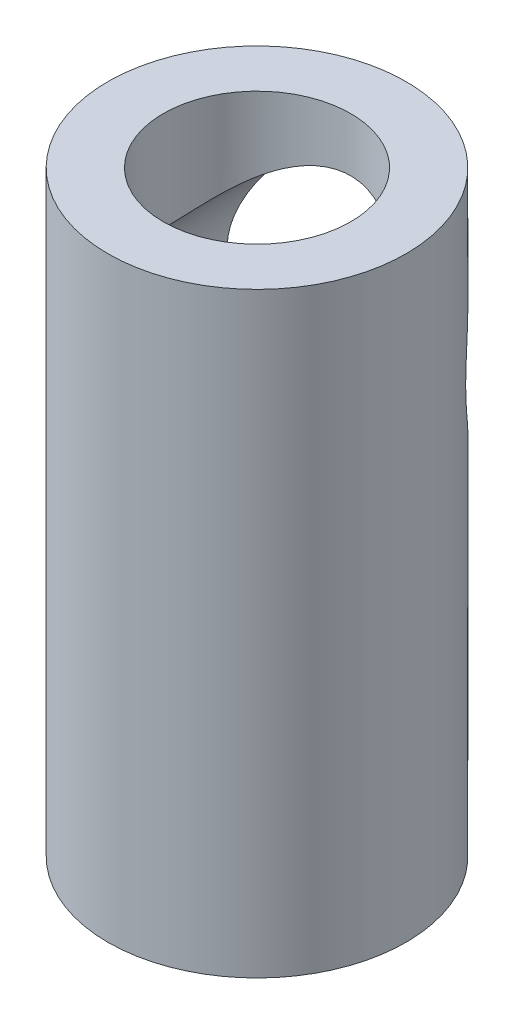
ISO-10303-21;
HEADER;
FILE_DESCRIPTION(('STEP AP214'),'2;1');
FILE_NAME('part.step','',(''),(''),'','','');
FILE_SCHEMA(('AUTOMOTIVE_DESIGN { 1 0 10303 214 1 1 1 1 }'));
ENDSEC;
DATA;
#1=APPLICATION_CONTEXT('core data for automotive mechanical design processes');
#2=APPLICATION_PROTOCOL_DEFINITION('international standard','automotive_design',2000,#1);
#3=PRODUCT_CONTEXT('',#1,'mechanical');
#4=PRODUCT('Part','Part','',(#3));
#5=PRODUCT_RELATED_PRODUCT_CATEGORY('part','',(#4));
#6=PRODUCT_DEFINITION_FORMATION('','',#4);
#7=PRODUCT_DEFINITION_CONTEXT('part definition',#1,'design');
#8=PRODUCT_DEFINITION('design','',#6,#7);
#9=PRODUCT_DEFINITION_SHAPE('','',#8);
#10=(LENGTH_UNIT() NAMED_UNIT(*) SI_UNIT(.MILLI.,.METRE.));
#11=(NAMED_UNIT(*) PLANE_ANGLE_UNIT() SI_UNIT($,.RADIAN.));
#12=(NAMED_UNIT(*) SI_UNIT($,.STERADIAN.) SOLID_ANGLE_UNIT());
#13=UNCERTAINTY_MEASURE_WITH_UNIT(LENGTH_MEASURE(1.E-05),#10,'distance_accuracy_value','');
#14=(GEOMETRIC_REPRESENTATION_CONTEXT(3) GLOBAL_UNCERTAINTY_ASSIGNED_CONTEXT((#13)) GLOBAL_UNIT_ASSIGNED_CONTEXT((#10,
#11,#12)) REPRESENTATION_CONTEXT('',''));
#15=CARTESIAN_POINT('',(0.,0.,0.));
#16=DIRECTION('',(0.,0.,1.));
#17=DIRECTION('',(1.,0.,0.));
#18=AXIS2_PLACEMENT_3D('',#15,#16,#17);
#19=CARTESIAN_POINT('',(0.,12.7,0.));
#20=DIRECTION('',(0.,-1.,0.));
#21=DIRECTION('',(0.,0.,-1.));
#22=AXIS2_PLACEMENT_3D('',#19,#20,#21);
#23=CYLINDRICAL_SURFACE('',#22,1.99644);
#24=CARTESIAN_POINT('',(0.,12.7,0.));
#25=DIRECTION('',(0.,1.,0.));
#26=DIRECTION('',(0.,0.,1.));
#27=AXIS2_PLACEMENT_3D('',#24,#25,#26);
#28=CIRCLE('',#27,1.99644);
#29=CARTESIAN_POINT('',(0.,12.7,1.99644));
#30=VERTEX_POINT('',#29);
#31=EDGE_CURVE('E95',#30,#30,#28,.T.);
#32=ORIENTED_EDGE('',*,*,#31,.T.);
#33=EDGE_LOOP('',(#32));
#34=FACE_BOUND('',#33,.T.);
#35=CARTESIAN_POINT('',(0.,0.,0.));
#36=DIRECTION('',(0.,1.,0.));
#37=DIRECTION('',(0.,0.,1.));
#38=AXIS2_PLACEMENT_3D('',#35,#36,#37);
#39=CIRCLE('',#38,1.99644);
#40=CARTESIAN_POINT('',(0.,0.,1.99644));
#41=VERTEX_POINT('',#40);
#42=EDGE_CURVE('E94',#41,#41,#39,.T.);
#43=ORIENTED_EDGE('',*,*,#42,.F.);
#44=EDGE_LOOP('',(#43));
#45=FACE_BOUND('',#44,.T.);
#46=CARTESIAN_POINT('',(1.99644,10.5822152991078,0.));
#47=CARTESIAN_POINT('',(1.9964463005246,10.5821966242857,-0.0387337429799469));
#48=CARTESIAN_POINT('',(1.99531228646733,10.5836497636297,-0.0774435311662304));
#49=CARTESIAN_POINT('',(1.99082713137895,10.5893317887897,-0.154468643708445));
#50=CARTESIAN_POINT('',(1.98747956822351,10.5935561951743,-0.192784503462716));
#51=CARTESIAN_POINT('',(1.97432408202278,10.6099950128558,-0.305795305995765));
#52=CARTESIAN_POINT('',(1.9613994796463,10.6259842645535,-0.379601433342756));
#53=CARTESIAN_POINT('',(1.92237889862255,10.6724136869936,-0.547763572937045));
#54=CARTESIAN_POINT('',(1.89329294440609,10.705923531777,-0.640535106962406));
#55=CARTESIAN_POINT('',(1.8234033956879,10.7809452721918,-0.818663209838582));
#56=CARTESIAN_POINT('',(1.78251817704875,10.8225122233225,-0.903962536833252));
#57=CARTESIAN_POINT('',(1.67489823815165,10.9233031721375,-1.09361707783881));
#58=CARTESIAN_POINT('',(1.60408561400169,10.9838270844775,-1.19497061049904));
#59=CARTESIAN_POINT('',(1.44475788948671,11.103380142199,-1.38333195877657));
#60=CARTESIAN_POINT('',(1.35627468377699,11.1624117678887,-1.47036511316438));
#61=CARTESIAN_POINT('',(1.18055956090027,11.2627147744716,-1.61316213452902));
#62=CARTESIAN_POINT('',(1.09631660209154,11.305224829584,-1.67172337897861));
#63=CARTESIAN_POINT('',(0.917178107880033,11.3825447532901,-1.77630936949658));
#64=CARTESIAN_POINT('',(0.822297255265876,11.4173650430194,-1.82235110177876));
#65=CARTESIAN_POINT('',(0.639178688856935,11.4717346256601,-1.89348787829357));
#66=CARTESIAN_POINT('',(0.552240526766419,11.4928238915142,-1.9207377349837));
#67=CARTESIAN_POINT('',(0.373802531060684,11.5258979164794,-1.96327243081508));
#68=CARTESIAN_POINT('',(0.282305275491662,11.5378877601841,-1.97856395220515));
#69=CARTESIAN_POINT('',(0.0969965506050353,11.5517720340635,-1.99625942570149));
#70=CARTESIAN_POINT('',(0.00317863503521173,11.5536341672712,-1.99862214840026));
#71=CARTESIAN_POINT('',(-0.18349081737818,11.5470047766862,-1.99018446656658));
#72=CARTESIAN_POINT('',(-0.276342280998579,11.5385124740668,-1.97938307187243));
#73=CARTESIAN_POINT('',(-0.453734743042755,11.5125938717335,-1.94618670678741));
#74=CARTESIAN_POINT('',(-0.538459517495308,11.4956315210298,-1.9243932606563));
#75=CARTESIAN_POINT('',(-0.702688416558516,11.4542567745515,-1.87068809611802));
#76=CARTESIAN_POINT('',(-0.782191064608584,11.429842282603,-1.83877353069553));
#77=CARTESIAN_POINT('',(-0.942425555503632,11.3722990483318,-1.76245688666435));
#78=CARTESIAN_POINT('',(-1.02248497358637,11.3385429429304,-1.71712507020438));
#79=CARTESIAN_POINT('',(-1.17404224390333,11.2658721514335,-1.61729525224422));
#80=CARTESIAN_POINT('',(-1.2455362747498,11.226955179046,-1.56279318538053));
#81=CARTESIAN_POINT('',(-1.39331052911668,11.1377533463852,-1.43385673586733));
#82=CARTESIAN_POINT('',(-1.46759650984634,11.086768142925,-1.35762387924088));
#83=CARTESIAN_POINT('',(-1.60314101957608,10.983918902561,-1.19456377019594));
#84=CARTESIAN_POINT('',(-1.66437327425071,10.9320533158698,-1.10771569393994));
#85=CARTESIAN_POINT('',(-1.76601593740187,10.8386416493312,-0.935739766214314));
#86=CARTESIAN_POINT('',(-1.8080975861482,10.7966300639973,-0.851852729875215));
#87=CARTESIAN_POINT('',(-1.88070292177933,10.7199382300122,-0.676493531540345));
#88=CARTESIAN_POINT('',(-1.91129634546775,10.6852143301899,-0.585071383702938));
#89=CARTESIAN_POINT('',(-1.94514990375713,10.6453903907417,-0.451399784491367));
#90=CARTESIAN_POINT('',(-1.95386860644447,10.6349235953403,-0.412085885343346));
#91=CARTESIAN_POINT('',(-1.96898491117781,10.6165502582146,-0.332434749252515));
#92=CARTESIAN_POINT('',(-1.97538381573136,10.6086422800484,-0.29209810021338));
#93=CARTESIAN_POINT('',(-1.98579238178351,10.5956824755678,-0.210071230083495));
#94=CARTESIAN_POINT('',(-1.98976757750303,10.5906719003926,-0.168369986071626));
#95=CARTESIAN_POINT('',(-1.99510016605165,10.5839186463664,-0.0844537132395872));
#96=CARTESIAN_POINT('',(-1.99645210729457,10.5821827731316,-0.0422377975387303));
#97=CARTESIAN_POINT('',(-1.99644,10.5822152991078,0.));
#98=B_SPLINE_CURVE_WITH_KNOTS('',3,(#46,#47,#48,#49,#50,#51,#52,#53,#54,#55,#56,#57,#58,#59,#60,
#61,#62,#63,#64,#65,#66,#67,#68,#69,#70,#71,#72,#73,#74,#75,#76,#77,#78,#79,#80,#81,#82,#83,#84,
#85,#86,#87,#88,#89,#90,#91,#92,#93,#94,#95,#96,#97),.UNSPECIFIED.,.F.,.F.,(4,2,2,2,2,2,2,2,2,2,
2,2,2,2,2,2,2,2,2,2,2,2,2,2,2,4),(0.,0.116114994838728,0.232042764191195,0.460801420564548,
0.767641512295879,1.07665732184653,1.48765687258356,1.89792118430971,2.22982502960757,
2.56127628187379,2.84063522513028,3.11983795245384,3.39993052915913,3.68004417480938,
3.9462661797961,4.21256313809551,4.50549555917943,4.79855818714912,5.15134943727248,
5.5048442120093,5.81244042285375,6.11813803552827,6.24283359782176,6.36745903790041,
6.49381769242233,6.62043866248348),.UNSPECIFIED.);
#99=CARTESIAN_POINT('',(1.99644,10.5822152991078,0.));
#100=VERTEX_POINT('',#99);
#101=CARTESIAN_POINT('',(-1.99644,10.5822152991078,0.));
#102=VERTEX_POINT('',#101);
#103=EDGE_CURVE('E41',#100,#102,#98,.T.);
#104=ORIENTED_EDGE('',*,*,#103,.F.);
#105=DIRECTION('',(0.,-1.,0.));
#106=VECTOR('',#105,1.);
#107=CARTESIAN_POINT('',(1.99644,12.7,0.));
#108=LINE('',#107,#106);
#109=CARTESIAN_POINT('',(1.99644,7.44162470089222,0.));
#110=VERTEX_POINT('',#109);
#111=EDGE_CURVE('E11',#100,#110,#108,.T.);
#112=ORIENTED_EDGE('',*,*,#111,.T.);
#113=CARTESIAN_POINT('',(-1.99644,7.44162470089222,0.));
#114=CARTESIAN_POINT('',(-1.9964463005246,7.4416433757143,-0.0387337429799468));
#115=CARTESIAN_POINT('',(-1.99531228646733,7.44019023637029,-0.0774435311662303));
#116=CARTESIAN_POINT('',(-1.99082713137895,7.43450821121027,-0.154468643708444));
#117=CARTESIAN_POINT('',(-1.98747956822351,7.43028380482575,-0.192784503462716));
#118=CARTESIAN_POINT('',(-1.97432408202278,7.4138449871442,-0.305795305995765));
#119=CARTESIAN_POINT('',(-1.9613994796463,7.39785573544649,-0.379601433342756));
#120=CARTESIAN_POINT('',(-1.92237889862255,7.35142631300639,-0.547763572937044));
#121=CARTESIAN_POINT('',(-1.89329294440609,7.31791646822298,-0.640535106962405));
#122=CARTESIAN_POINT('',(-1.8234033956879,7.24289472780824,-0.818663209838581));
#123=CARTESIAN_POINT('',(-1.78251817704875,7.20132777667751,-0.90396253683325));
#124=CARTESIAN_POINT('',(-1.67489823815165,7.1005368278625,-1.0936170778388));
#125=CARTESIAN_POINT('',(-1.60408561400169,7.0400129155225,-1.19497061049904));
#126=CARTESIAN_POINT('',(-1.44475788948671,6.92045985780098,-1.38333195877657));
#127=CARTESIAN_POINT('',(-1.35627468377699,6.8614282321113,-1.47036511316438));
#128=CARTESIAN_POINT('',(-1.18055956090027,6.76112522552838,-1.61316213452902));
#129=CARTESIAN_POINT('',(-1.09631660209154,6.71861517041604,-1.67172337897861));
#130=CARTESIAN_POINT('',(-0.917178107880034,6.64129524670986,-1.77630936949658));
#131=CARTESIAN_POINT('',(-0.822297255265876,6.60647495698061,-1.82235110177876));
#132=CARTESIAN_POINT('',(-0.639178688856935,6.55210537433995,-1.89348787829357));
#133=CARTESIAN_POINT('',(-0.552240526766419,6.53101610848578,-1.9207377349837));
#134=CARTESIAN_POINT('',(-0.373802531060684,6.49794208352065,-1.96327243081508));
#135=CARTESIAN_POINT('',(-0.282305275491662,6.48595223981587,-1.97856395220515));
#136=CARTESIAN_POINT('',(-0.0969965506050353,6.4720679659365,-1.99625942570149));
#137=CARTESIAN_POINT('',(-0.0031786350352115,6.47020583272882,-1.99862214840026));
#138=CARTESIAN_POINT('',(0.18349081737818,6.47683522331381,-1.99018446656658));
#139=CARTESIAN_POINT('',(0.276342280998579,6.48532752593319,-1.97938307187243));
#140=CARTESIAN_POINT('',(0.453734743042756,6.51124612826647,-1.94618670678741));
#141=CARTESIAN_POINT('',(0.538459517495308,6.52820847897017,-1.9243932606563));
#142=CARTESIAN_POINT('',(0.702688416558516,6.56958322544851,-1.87068809611802));
#143=CARTESIAN_POINT('',(0.782191064608584,6.59399771739699,-1.83877353069553));
#144=CARTESIAN_POINT('',(0.942425555503632,6.65154095166822,-1.76245688666435));
#145=CARTESIAN_POINT('',(1.02248497358637,6.6852970570696,-1.71712507020438));
#146=CARTESIAN_POINT('',(1.17404224390333,6.75796784856649,-1.61729525224422));
#147=CARTESIAN_POINT('',(1.2455362747498,6.79688482095399,-1.56279318538053));
#148=CARTESIAN_POINT('',(1.39331052911668,6.88608665361482,-1.43385673586733));
#149=CARTESIAN_POINT('',(1.46759650984634,6.93707185707505,-1.35762387924088));
#150=CARTESIAN_POINT('',(1.60314101957608,7.03992109743897,-1.19456377019594));
#151=CARTESIAN_POINT('',(1.66437327425071,7.09178668413025,-1.10771569393994));
#152=CARTESIAN_POINT('',(1.76601593740187,7.18519835066877,-0.935739766214314));
#153=CARTESIAN_POINT('',(1.8080975861482,7.22720993600265,-0.851852729875216));
#154=CARTESIAN_POINT('',(1.88070292177933,7.30390176998783,-0.676493531540346));
#155=CARTESIAN_POINT('',(1.91129634546775,7.33862566981008,-0.585071383702938));
#156=CARTESIAN_POINT('',(1.94514990375713,7.37844960925827,-0.451399784491367));
#157=CARTESIAN_POINT('',(1.95386860644447,7.38891640465967,-0.412085885343346));
#158=CARTESIAN_POINT('',(1.96898491117781,7.40728974178542,-0.332434749252515));
#159=CARTESIAN_POINT('',(1.97538381573136,7.41519771995159,-0.29209810021338));
#160=CARTESIAN_POINT('',(1.98579238178351,7.42815752443225,-0.210071230083495));
#161=CARTESIAN_POINT('',(1.98976757750303,7.43316809960737,-0.168369986071626));
#162=CARTESIAN_POINT('',(1.99510016605165,7.43992135363365,-0.0844537132395879));
#163=CARTESIAN_POINT('',(1.99645210729457,7.44165722686845,-0.0422377975387307));
#164=CARTESIAN_POINT('',(1.99644,7.44162470089219,0.));
#165=B_SPLINE_CURVE_WITH_KNOTS('',3,(#113,#114,#115,#116,#117,#118,#119,#120,#121,#122,#123,
#124,#125,#126,#127,#128,#129,#130,#131,#132,#133,#134,#135,#136,#137,#138,#139,#140,#141,#142,
#143,#144,#145,#146,#147,#148,#149,#150,#151,#152,#153,#154,#155,#156,#157,#158,#159,#160,#161,
#162,#163,#164),.UNSPECIFIED.,.F.,.F.,(4,2,2,2,2,2,2,2,2,2,2,2,2,2,2,2,2,2,2,2,2,2,2,2,2,4),(0.,
0.116114994838728,0.232042764191194,0.460801420564547,0.767641512295877,1.07665732184653,
1.48765687258356,1.89792118430971,2.22982502960757,2.56127628187379,2.84063522513028,
3.11983795245384,3.39993052915913,3.68004417480938,3.9462661797961,4.21256313809551,
4.50549555917943,4.79855818714912,5.15134943727248,5.5048442120093,5.81244042285375,
6.11813803552827,6.24283359782176,6.36745903790041,6.49381769242233,6.62043866248347),.UNSPECIFIED.);
#166=CARTESIAN_POINT('',(-1.99644,7.44162470089222,0.));
#167=VERTEX_POINT('',#166);
#168=EDGE_CURVE('E68',#167,#110,#165,.T.);
#169=ORIENTED_EDGE('',*,*,#168,.F.);
#170=DIRECTION('',(0.,-1.,0.));
#171=VECTOR('',#170,1.);
#172=CARTESIAN_POINT('',(-1.99644,12.7,0.));
#173=LINE('',#172,#171);
#174=EDGE_CURVE('E51',#167,#102,#173,.F.);
#175=ORIENTED_EDGE('',*,*,#174,.T.);
#176=EDGE_LOOP('',(#104,#112,#169,#175));
#177=FACE_BOUND('',#176,.T.);
#178=ADVANCED_FACE('F32',(#34,#45,#177),#23,.F.);
#179=CARTESIAN_POINT('',(0.,12.7,0.));
#180=DIRECTION('',(0.,1.,0.));
#181=DIRECTION('',(0.,0.,1.));
#182=AXIS2_PLACEMENT_3D('',#179,#180,#181);
#183=PLANE('',#182);
#184=CARTESIAN_POINT('',(0.,12.7,0.));
#185=DIRECTION('',(0.,1.,0.));
#186=DIRECTION('',(0.,0.,1.));
#187=AXIS2_PLACEMENT_3D('',#184,#185,#186);
#188=CIRCLE('',#187,3.175);
#189=CARTESIAN_POINT('',(0.,12.7,3.175));
#190=VERTEX_POINT('',#189);
#191=EDGE_CURVE('E101',#190,#190,#188,.T.);
#192=ORIENTED_EDGE('',*,*,#191,.T.);
#193=EDGE_LOOP('',(#192));
#194=FACE_BOUND('',#193,.T.);
#195=ORIENTED_EDGE('',*,*,#31,.F.);
#196=EDGE_LOOP('',(#195));
#197=FACE_BOUND('',#196,.T.);
#198=ADVANCED_FACE('F111',(#194,#197),#183,.T.);
#199=CARTESIAN_POINT('',(0.,0.,0.));
#200=DIRECTION('',(0.,1.,0.));
#201=DIRECTION('',(0.,0.,1.));
#202=AXIS2_PLACEMENT_3D('',#199,#200,#201);
#203=PLANE('',#202);
#204=CARTESIAN_POINT('',(0.,0.,0.));
#205=DIRECTION('',(0.,1.,0.));
#206=DIRECTION('',(0.,0.,1.));
#207=AXIS2_PLACEMENT_3D('',#204,#205,#206);
#208=CIRCLE('',#207,3.175);
#209=CARTESIAN_POINT('',(0.,0.,3.175));
#210=VERTEX_POINT('',#209);
#211=EDGE_CURVE('E98',#210,#210,#208,.T.);
#212=ORIENTED_EDGE('',*,*,#211,.F.);
#213=EDGE_LOOP('',(#212));
#214=FACE_BOUND('',#213,.T.);
#215=ORIENTED_EDGE('',*,*,#42,.T.);
#216=EDGE_LOOP('',(#215));
#217=FACE_BOUND('',#216,.T.);
#218=ADVANCED_FACE('F108',(#214,#217),#203,.F.);
#219=CARTESIAN_POINT('',(0.,12.7,0.));
#220=DIRECTION('',(0.,-1.,0.));
#221=DIRECTION('',(0.,0.,-1.));
#222=AXIS2_PLACEMENT_3D('',#219,#220,#221);
#223=CYLINDRICAL_SURFACE('',#222,3.175);
#224=CARTESIAN_POINT('',(0.,11.55192,-3.175));
#225=CARTESIAN_POINT('',(-0.121916056806821,11.551910381511,-3.17499067440978));
#226=CARTESIAN_POINT('',(-0.244009117648219,11.5430688541664,-3.16790542167364));
#227=CARTESIAN_POINT('',(-0.484275631656092,11.5082955475146,-3.14019267794238));
#228=CARTESIAN_POINT('',(-0.602439805075391,11.4823259612644,-3.11953522928575));
#229=CARTESIAN_POINT('',(-0.830700396816502,11.4151686923597,-3.06662752834783));
#230=CARTESIAN_POINT('',(-0.940843005309833,11.3740780402914,-3.03445122657939));
#231=CARTESIAN_POINT('',(-1.15179698240407,11.2787205771733,-2.96082673890646));
#232=CARTESIAN_POINT('',(-1.25260832144289,11.2244537243824,-2.91937852362935));
#233=CARTESIAN_POINT('',(-1.47723739630781,11.0837639715427,-2.814013964251));
#234=CARTESIAN_POINT('',(-1.59684492679289,10.9927236266683,-2.74729930858401));
#235=CARTESIAN_POINT('',(-1.81663743277592,10.7933681822833,-2.60719770642894));
#236=CARTESIAN_POINT('',(-1.9167645970712,10.6850033522324,-2.53379182148377));
#237=CARTESIAN_POINT('',(-2.05251440851993,10.5100307722808,-2.4230781427805));
#238=CARTESIAN_POINT('',(-2.09564259655402,10.449097364641,-2.38577210507023));
#239=CARTESIAN_POINT('',(-2.17663118203204,10.3232107112069,-2.31211856629064));
#240=CARTESIAN_POINT('',(-2.21448991412076,10.258256203915,-2.27577137118137));
#241=CARTESIAN_POINT('',(-2.28461962929066,10.1244846762943,-2.20535720711848));
#242=CARTESIAN_POINT('',(-2.31690574413233,10.0556788097027,-2.17128422240549));
#243=CARTESIAN_POINT('',(-2.37564828002066,9.9140123499401,-2.10685050405413));
#244=CARTESIAN_POINT('',(-2.4021096817228,9.84115528821686,-2.07648660877656));
#245=CARTESIAN_POINT('',(-2.45218859937187,9.68012375949292,-2.01720580480069));
#246=CARTESIAN_POINT('',(-2.47479043828276,9.59128717153127,-1.98918297776046));
#247=CARTESIAN_POINT('',(-2.51045324124669,9.40915183237907,-1.94398945258816));
#248=CARTESIAN_POINT('',(-2.52353766108226,9.31586465912017,-1.9267920891738));
#249=CARTESIAN_POINT('',(-2.53923570130587,9.12597783672581,-1.90606928123794));
#250=CARTESIAN_POINT('',(-2.5417570317968,9.02935639784543,-1.90266434993769));
#251=CARTESIAN_POINT('',(-2.53580237504371,8.83703360254909,-1.91058760234381));
#252=CARTESIAN_POINT('',(-2.52731708059048,8.74133309384127,-1.92192825494492));
#253=CARTESIAN_POINT('',(-2.4980308524335,8.53920045232671,-1.95987335440708));
#254=CARTESIAN_POINT('',(-2.47550909839874,8.43343522399161,-1.98859033885116));
#255=CARTESIAN_POINT('',(-2.41864361078571,8.22890941675305,-2.05736679355416));
#256=CARTESIAN_POINT('',(-2.38426486174821,8.13017064177255,-2.0974597959851));
#257=CARTESIAN_POINT('',(-2.31516532928433,7.96430565259803,-2.17314568245185));
#258=CARTESIAN_POINT('',(-2.28274974571616,7.8955204368362,-2.20729465009924));
#259=CARTESIAN_POINT('',(-2.21244149211587,7.76196038996822,-2.27776451851087));
#260=CARTESIAN_POINT('',(-2.17454629070866,7.6971874322353,-2.31408641851564));
#261=CARTESIAN_POINT('',(-2.05287712397247,7.50868820434028,-2.42451522131284));
#262=CARTESIAN_POINT('',(-1.96113794094088,7.39082486467285,-2.50006385092802));
#263=CARTESIAN_POINT('',(-1.75443281259859,7.16877645245503,-2.64940692741269));
#264=CARTESIAN_POINT('',(-1.63891345424478,7.06503915247778,-2.72310110288538));
#265=CARTESIAN_POINT('',(-1.38682587170398,6.87820012423629,-2.85967617666903));
#266=CARTESIAN_POINT('',(-1.25031568575768,6.79504309890518,-2.92258590857053));
#267=CARTESIAN_POINT('',(-1.00047701457708,6.67440414037754,-3.01529329761312));
#268=CARTESIAN_POINT('',(-0.891765496795295,6.63066399983512,-3.04941088850288));
#269=CARTESIAN_POINT('',(-0.666640899895133,6.5581196865614,-3.10638878047358));
#270=CARTESIAN_POINT('',(-0.550233700270669,6.52930425672557,-3.1292575654161));
#271=CARTESIAN_POINT('',(-0.3120557484768,6.48825396999684,-3.16192333979135));
#272=CARTESIAN_POINT('',(-0.190260344528543,6.47610574143051,-3.17165202911017));
#273=CARTESIAN_POINT('',(0.0541121480131782,6.46955902793976,-3.17688824985488));
#274=CARTESIAN_POINT('',(0.17668908675252,6.47515723668043,-3.17239843032823));
#275=CARTESIAN_POINT('',(0.408618279875381,6.50250517187019,-3.15057610960551));
#276=CARTESIAN_POINT('',(0.518237333524822,6.52290945114934,-3.13431367684265));
#277=CARTESIAN_POINT('',(0.731946305276196,6.57716767127657,-3.09140241651237));
#278=CARTESIAN_POINT('',(0.836034572070747,6.61102560363662,-3.06475050657596));
#279=CARTESIAN_POINT('',(1.04296956478185,6.69309097180041,-3.00088108815239));
#280=CARTESIAN_POINT('',(1.14534139675652,6.74205634809921,-2.96311209183829));
#281=CARTESIAN_POINT('',(1.34037070559947,6.85147493263902,-2.88015200849108));
#282=CARTESIAN_POINT('',(1.43302769765854,6.91192871377418,-2.83496055133617));
#283=CARTESIAN_POINT('',(1.6246505172263,7.05513488436034,-2.73041983146999));
#284=CARTESIAN_POINT('',(1.72149413131872,7.13994214754575,-2.67000951566095));
#285=CARTESIAN_POINT('',(1.90060183219128,7.32204144030697,-2.54563242438724));
#286=CARTESIAN_POINT('',(1.9828227760452,7.41936900036895,-2.48165583311078));
#287=CARTESIAN_POINT('',(2.10271979738413,7.58499174437738,-2.37965151760253));
#288=CARTESIAN_POINT('',(2.14520452278852,7.64966795473787,-2.34130524197817));
#289=CARTESIAN_POINT('',(2.22446852236799,7.78335026752446,-2.26612977994706));
#290=CARTESIAN_POINT('',(2.26124476990605,7.8523586398183,-2.22930140588074));
#291=CARTESIAN_POINT('',(2.32865642406995,7.99450935477488,-2.15878554170672));
#292=CARTESIAN_POINT('',(2.35931301699906,8.06763627022831,-2.12508743916287));
#293=CARTESIAN_POINT('',(2.41413621132369,8.21822142873801,-2.06259479208208));
#294=CARTESIAN_POINT('',(2.43831081807813,8.29567418505562,-2.0337942152599));
#295=CARTESIAN_POINT('',(2.48107410278354,8.46085012330635,-1.98144663954073));
#296=CARTESIAN_POINT('',(2.49910040803062,8.54890677818625,-1.95846340273127));
#297=CARTESIAN_POINT('',(2.52576210184161,8.72850377444938,-1.92396581878866));
#298=CARTESIAN_POINT('',(2.53442118096212,8.82003471863629,-1.91242254519817));
#299=CARTESIAN_POINT('',(2.54167714779861,9.00474284722886,-1.90277415620508));
#300=CARTESIAN_POINT('',(2.54021997010044,9.09792621817986,-1.90474124510769));
#301=CARTESIAN_POINT('',(2.52725578930016,9.28240995378061,-1.92190080460199));
#302=CARTESIAN_POINT('',(2.51573285283507,9.37370709802192,-1.93711424307603));
#303=CARTESIAN_POINT('',(2.4791384138358,9.57657046844474,-1.98382985522335));
#304=CARTESIAN_POINT('',(2.4512174062928,9.68682674733172,-2.01865549946641));
#305=CARTESIAN_POINT('',(2.38262367002429,9.89918508705041,-2.09916920976265));
#306=CARTESIAN_POINT('',(2.34191337500132,10.0012619993055,-2.14488917919507));
#307=CARTESIAN_POINT('',(2.26180450174411,10.1703826093669,-2.22873672661885));
#308=CARTESIAN_POINT('',(2.22507321384965,10.239391292699,-2.26553679421145));
#309=CARTESIAN_POINT('',(2.14585234171697,10.3731568393509,-2.34071002847767));
#310=CARTESIAN_POINT('',(2.10336041534563,10.4379119572961,-2.37908383054344));
#311=CARTESIAN_POINT('',(2.01274435888431,10.5631887775406,-2.45622189782701));
#312=CARTESIAN_POINT('',(1.96461678278865,10.623707853133,-2.4949863885594));
#313=CARTESIAN_POINT('',(1.86283257687258,10.7403464229814,-2.57187964652039));
#314=CARTESIAN_POINT('',(1.80917310856298,10.7964636323147,-2.61000807560259));
#315=CARTESIAN_POINT('',(1.63841517285142,10.9592502311975,-2.7230364455779));
#316=CARTESIAN_POINT('',(1.51261205501336,11.0588545691878,-2.79561799333142));
#317=CARTESIAN_POINT('',(1.308071147282,11.1907092454186,-2.89401498363328));
#318=CARTESIAN_POINT('',(1.23730205085332,11.2317147629242,-2.92505149614458));
#319=CARTESIAN_POINT('',(1.0907479383402,11.3072756504782,-2.98279779640671));
#320=CARTESIAN_POINT('',(1.0149660308878,11.3418349681893,-3.00951023089613));
#321=CARTESIAN_POINT('',(0.831896987075438,11.414481426834,-3.06604626395477));
#322=CARTESIAN_POINT('',(0.722769759834727,11.4496631882266,-3.09375693819079));
#323=CARTESIAN_POINT('',(0.498745877533643,11.505130050677,-3.13764738721121));
#324=CARTESIAN_POINT('',(0.383865187493357,11.5254541714818,-3.15385736227613));
#325=CARTESIAN_POINT('',(0.223368768181192,11.54247505402,-3.16744831636526));
#326=CARTESIAN_POINT('',(0.178826858714191,11.5460111745755,-3.17027457213494));
#327=CARTESIAN_POINT('',(0.0895312884821994,11.5507356751107,-3.17405233508709));
#328=CARTESIAN_POINT('',(0.0447775828203425,11.5519235326986,-3.17500342512216));
#329=CARTESIAN_POINT('',(0.,11.55192,-3.175));
#330=B_SPLINE_CURVE_WITH_KNOTS('',3,(#224,#225,#226,#227,#228,#229,#230,#231,#232,#233,#234,
#235,#236,#237,#238,#239,#240,#241,#242,#243,#244,#245,#246,#247,#248,#249,#250,#251,#252,#253,
#254,#255,#256,#257,#258,#259,#260,#261,#262,#263,#264,#265,#266,#267,#268,#269,#270,#271,#272,
#273,#274,#275,#276,#277,#278,#279,#280,#281,#282,#283,#284,#285,#286,#287,#288,#289,#290,#291,
#292,#293,#294,#295,#296,#297,#298,#299,#300,#301,#302,#303,#304,#305,#306,#307,#308,#309,#310,
#311,#312,#313,#314,#315,#316,#317,#318,#319,#320,#321,#322,#323,#324,#325,#326,#327,#328,#329),
.UNSPECIFIED.,.T.,.F.,(4,2,2,2,2,2,2,2,2,2,2,2,2,2,2,2,2,2,2,2,2,2,2,2,2,2,2,2,2,2,2,2,2,2,2,2,
2,2,2,2,2,2,2,2,2,2,2,2,2,2,2,2,4),(0.,0.365552489610105,0.731914579651965,1.09596562270827,
1.46001781906292,1.95082018014128,2.44305757498571,2.69320827669722,2.94343785722167,
3.19297689873339,3.44230172571769,3.72887968210093,4.01474894865158,4.30311071752822,
4.59171648433463,4.92552630697511,5.26033048196404,5.51008793340424,5.75996113409958,
6.25986066386893,6.77307093287109,7.28488691142476,7.64957165429315,8.01398092819179,
8.38027714633571,8.74650512392156,9.08305909482279,9.41971299125474,9.77718709586305,
10.1346790313703,10.5597964551746,10.9861480627386,11.2449744535812,11.503937608945,
11.7619880597763,12.0197183306271,12.2969862474645,12.5735512774942,12.8515955177088,
13.1300806808756,13.4849591304104,13.8408898764295,14.099799843131,14.3588153936922,
14.6179901585999,14.8772985778308,15.402087755042,15.6641455855371,15.9260424006869,
16.2784102558896,16.6298493506074,16.7640803714895,16.8983412498957),.UNSPECIFIED.);
#331=CARTESIAN_POINT('',(0.,11.55192,-3.175));
#332=VERTEX_POINT('',#331);
#333=EDGE_CURVE('E69',#332,#332,#330,.T.);
#334=ORIENTED_EDGE('',*,*,#333,.T.);
#335=EDGE_LOOP('',(#334));
#336=FACE_BOUND('',#335,.T.);
#337=ORIENTED_EDGE('',*,*,#191,.F.);
#338=EDGE_LOOP('',(#337));
#339=FACE_BOUND('',#338,.T.);
#340=ORIENTED_EDGE('',*,*,#211,.T.);
#341=EDGE_LOOP('',(#340));
#342=FACE_BOUND('',#341,.T.);
#343=ADVANCED_FACE('F34',(#336,#339,#342),#223,.T.);
#344=CARTESIAN_POINT('',(0.,9.01192,0.));
#345=DIRECTION('',(0.,0.,-1.));
#346=DIRECTION('',(-1.,0.,0.));
#347=AXIS2_PLACEMENT_3D('',#344,#345,#346);
#348=CYLINDRICAL_SURFACE('',#347,2.54);
#349=ORIENTED_EDGE('',*,*,#103,.T.);
#350=CARTESIAN_POINT('',(0.,9.01192,0.));
#351=DIRECTION('',(0.,0.,-1.));
#352=DIRECTION('',(-1.,0.,0.));
#353=AXIS2_PLACEMENT_3D('',#350,#351,#352);
#354=CIRCLE('',#353,2.54);
#355=EDGE_CURVE('E47',#167,#102,#354,.T.);
#356=ORIENTED_EDGE('',*,*,#355,.F.);
#357=ORIENTED_EDGE('',*,*,#168,.T.);
#358=EDGE_CURVE('E61',#100,#110,#354,.T.);
#359=ORIENTED_EDGE('',*,*,#358,.F.);
#360=EDGE_LOOP('',(#349,#356,#357,#359));
#361=FACE_BOUND('',#360,.T.);
#362=ORIENTED_EDGE('',*,*,#333,.F.);
#363=EDGE_LOOP('',(#362));
#364=FACE_BOUND('',#363,.T.);
#365=ADVANCED_FACE('F66',(#361,#364),#348,.F.);
#366=CARTESIAN_POINT('',(0.,9.01192,0.));
#367=DIRECTION('',(0.,0.,-1.));
#368=DIRECTION('',(-1.,0.,0.));
#369=AXIS2_PLACEMENT_3D('',#366,#367,#368);
#370=PLANE('',#369);
#371=ORIENTED_EDGE('',*,*,#358,.T.);
#372=ORIENTED_EDGE('',*,*,#111,.F.);
#373=EDGE_LOOP('',(#371,#372));
#374=FACE_BOUND('',#373,.T.);
#375=ADVANCED_FACE('F60',(#374),#370,.T.);
#376=ORIENTED_EDGE('',*,*,#355,.T.);
#377=ORIENTED_EDGE('',*,*,#174,.F.);
#378=EDGE_LOOP('',(#376,#377));
#379=FACE_BOUND('',#378,.T.);
#380=ADVANCED_FACE('F86',(#379),#370,.T.);
#381=CLOSED_SHELL('',(#178,#198,#218,#343,#365,#375,#380));
#382=MANIFOLD_SOLID_BREP('B2',#381);
#383=ADVANCED_BREP_SHAPE_REPRESENTATION('',(#18,#382),#14);
#384=SHAPE_DEFINITION_REPRESENTATION(#9,#383);
ENDSEC;
END-ISO-10303-21;
